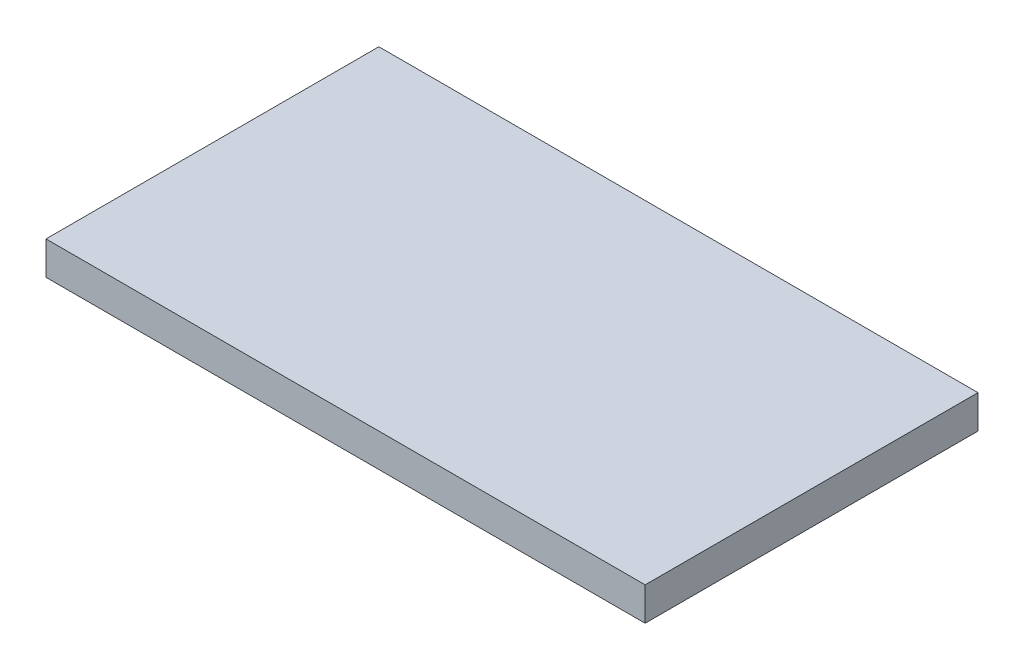
ISO-10303-21;
HEADER;
FILE_DESCRIPTION(('STEP AP214'),'2;1');
FILE_NAME('part.step','',(''),(''),'','','');
FILE_SCHEMA(('AUTOMOTIVE_DESIGN { 1 0 10303 214 1 1 1 1 }'));
ENDSEC;
DATA;
#1=APPLICATION_CONTEXT('core data for automotive mechanical design processes');
#2=APPLICATION_PROTOCOL_DEFINITION('international standard','automotive_design',2000,#1);
#3=PRODUCT_CONTEXT('',#1,'mechanical');
#4=PRODUCT('Part','Part','',(#3));
#5=PRODUCT_RELATED_PRODUCT_CATEGORY('part','',(#4));
#6=PRODUCT_DEFINITION_FORMATION('','',#4);
#7=PRODUCT_DEFINITION_CONTEXT('part definition',#1,'design');
#8=PRODUCT_DEFINITION('design','',#6,#7);
#9=PRODUCT_DEFINITION_SHAPE('','',#8);
#10=(LENGTH_UNIT() NAMED_UNIT(*) SI_UNIT(.MILLI.,.METRE.));
#11=(NAMED_UNIT(*) PLANE_ANGLE_UNIT() SI_UNIT($,.RADIAN.));
#12=(NAMED_UNIT(*) SI_UNIT($,.STERADIAN.) SOLID_ANGLE_UNIT());
#13=UNCERTAINTY_MEASURE_WITH_UNIT(LENGTH_MEASURE(1.E-05),#10,'distance_accuracy_value','');
#14=(GEOMETRIC_REPRESENTATION_CONTEXT(3) GLOBAL_UNCERTAINTY_ASSIGNED_CONTEXT((#13)) GLOBAL_UNIT_ASSIGNED_CONTEXT((#10,
#11,#12)) REPRESENTATION_CONTEXT('',''));
#15=CARTESIAN_POINT('',(0.,0.,0.));
#16=DIRECTION('',(0.,0.,1.));
#17=DIRECTION('',(1.,0.,0.));
#18=AXIS2_PLACEMENT_3D('',#15,#16,#17);
#19=CARTESIAN_POINT('',(-47.625,1.5875,7.9375));
#20=DIRECTION('',(0.,0.,-1.));
#21=DIRECTION('',(-1.,0.,0.));
#22=AXIS2_PLACEMENT_3D('',#19,#20,#21);
#23=PLANE('',#22);
#24=DIRECTION('',(0.,1.,0.));
#25=VECTOR('',#24,1.);
#26=CARTESIAN_POINT('',(-14.2875,-0.9525,7.9375));
#27=LINE('',#26,#25);
#28=CARTESIAN_POINT('',(-14.2875,0.,7.9375));
#29=VERTEX_POINT('',#28);
#30=CARTESIAN_POINT('',(-14.2875,1.5875,7.9375));
#31=VERTEX_POINT('',#30);
#32=EDGE_CURVE('E85',#29,#31,#27,.T.);
#33=ORIENTED_EDGE('',*,*,#32,.F.);
#34=DIRECTION('',(1.,0.,0.));
#35=VECTOR('',#34,1.);
#36=CARTESIAN_POINT('',(-47.625,0.,7.9375));
#37=LINE('',#36,#35);
#38=CARTESIAN_POINT('',(14.2875,0.,7.9375));
#39=VERTEX_POINT('',#38);
#40=EDGE_CURVE('E94',#29,#39,#37,.T.);
#41=ORIENTED_EDGE('',*,*,#40,.T.);
#42=DIRECTION('',(0.,1.,0.));
#43=VECTOR('',#42,1.);
#44=CARTESIAN_POINT('',(14.2875,-0.9525,7.9375));
#45=LINE('',#44,#43);
#46=CARTESIAN_POINT('',(14.2875,1.5875,7.9375));
#47=VERTEX_POINT('',#46);
#48=EDGE_CURVE('E53',#39,#47,#45,.T.);
#49=ORIENTED_EDGE('',*,*,#48,.T.);
#50=DIRECTION('',(1.,0.,0.));
#51=VECTOR('',#50,1.);
#52=CARTESIAN_POINT('',(-47.625,1.5875,7.9375));
#53=LINE('',#52,#51);
#54=EDGE_CURVE('E92',#31,#47,#53,.T.);
#55=ORIENTED_EDGE('',*,*,#54,.F.);
#56=EDGE_LOOP('',(#33,#41,#49,#55));
#57=FACE_BOUND('',#56,.T.);
#58=ADVANCED_FACE('F38',(#57),#23,.F.);
#59=CARTESIAN_POINT('',(-47.625,1.5875,-7.9375));
#60=DIRECTION('',(0.,0.,1.));
#61=DIRECTION('',(1.,0.,0.));
#62=AXIS2_PLACEMENT_3D('',#59,#60,#61);
#63=PLANE('',#62);
#64=DIRECTION('',(0.,1.,0.));
#65=VECTOR('',#64,1.);
#66=CARTESIAN_POINT('',(-14.2875,-0.9525,-7.9375));
#67=LINE('',#66,#65);
#68=CARTESIAN_POINT('',(-14.2875,0.,-7.9375));
#69=VERTEX_POINT('',#68);
#70=CARTESIAN_POINT('',(-14.2875,1.5875,-7.9375));
#71=VERTEX_POINT('',#70);
#72=EDGE_CURVE('E60',#69,#71,#67,.T.);
#73=ORIENTED_EDGE('',*,*,#72,.T.);
#74=DIRECTION('',(-1.,0.,0.));
#75=VECTOR('',#74,1.);
#76=CARTESIAN_POINT('',(-47.625,1.5875,-7.9375));
#77=LINE('',#76,#75);
#78=CARTESIAN_POINT('',(14.2875,1.5875,-7.9375));
#79=VERTEX_POINT('',#78);
#80=EDGE_CURVE('E100',#79,#71,#77,.T.);
#81=ORIENTED_EDGE('',*,*,#80,.F.);
#82=DIRECTION('',(0.,1.,0.));
#83=VECTOR('',#82,1.);
#84=CARTESIAN_POINT('',(14.2875,-0.9525,-7.9375));
#85=LINE('',#84,#83);
#86=CARTESIAN_POINT('',(14.2875,0.,-7.9375));
#87=VERTEX_POINT('',#86);
#88=EDGE_CURVE('E79',#87,#79,#85,.T.);
#89=ORIENTED_EDGE('',*,*,#88,.F.);
#90=DIRECTION('',(-1.,0.,0.));
#91=VECTOR('',#90,1.);
#92=CARTESIAN_POINT('',(-47.625,0.,-7.9375));
#93=LINE('',#92,#91);
#94=EDGE_CURVE('E101',#87,#69,#93,.T.);
#95=ORIENTED_EDGE('',*,*,#94,.T.);
#96=EDGE_LOOP('',(#73,#81,#89,#95));
#97=FACE_BOUND('',#96,.T.);
#98=ADVANCED_FACE('F115',(#97),#63,.F.);
#99=CARTESIAN_POINT('',(-47.625,1.5875,0.));
#100=DIRECTION('',(0.,1.,0.));
#101=DIRECTION('',(0.,0.,1.));
#102=AXIS2_PLACEMENT_3D('',#99,#100,#101);
#103=PLANE('',#102);
#104=ORIENTED_EDGE('',*,*,#80,.T.);
#105=DIRECTION('',(0.,0.,1.));
#106=VECTOR('',#105,1.);
#107=CARTESIAN_POINT('',(-14.2875,1.5875,-7.9375));
#108=LINE('',#107,#106);
#109=EDGE_CURVE('E86',#71,#31,#108,.T.);
#110=ORIENTED_EDGE('',*,*,#109,.T.);
#111=ORIENTED_EDGE('',*,*,#54,.T.);
#112=DIRECTION('',(0.,0.,-1.));
#113=VECTOR('',#112,1.);
#114=CARTESIAN_POINT('',(14.2875,1.5875,-7.9375));
#115=LINE('',#114,#113);
#116=EDGE_CURVE('E76',#47,#79,#115,.T.);
#117=ORIENTED_EDGE('',*,*,#116,.T.);
#118=EDGE_LOOP('',(#104,#110,#111,#117));
#119=FACE_BOUND('',#118,.T.);
#120=ADVANCED_FACE('F98',(#119),#103,.T.);
#121=CARTESIAN_POINT('',(-47.625,0.,0.));
#122=DIRECTION('',(0.,1.,0.));
#123=DIRECTION('',(0.,0.,1.));
#124=AXIS2_PLACEMENT_3D('',#121,#122,#123);
#125=PLANE('',#124);
#126=DIRECTION('',(0.,0.,1.));
#127=VECTOR('',#126,1.);
#128=CARTESIAN_POINT('',(-14.2875,0.,0.));
#129=LINE('',#128,#127);
#130=EDGE_CURVE('E11',#69,#29,#129,.T.);
#131=ORIENTED_EDGE('',*,*,#130,.F.);
#132=ORIENTED_EDGE('',*,*,#94,.F.);
#133=DIRECTION('',(0.,0.,-1.));
#134=VECTOR('',#133,1.);
#135=CARTESIAN_POINT('',(14.2875,0.,0.));
#136=LINE('',#135,#134);
#137=EDGE_CURVE('E46',#39,#87,#136,.T.);
#138=ORIENTED_EDGE('',*,*,#137,.F.);
#139=ORIENTED_EDGE('',*,*,#40,.F.);
#140=EDGE_LOOP('',(#131,#132,#138,#139));
#141=FACE_BOUND('',#140,.T.);
#142=ADVANCED_FACE('F118',(#141),#125,.F.);
#143=CARTESIAN_POINT('',(14.2875,-0.9525,-7.9375));
#144=DIRECTION('',(1.,0.,0.));
#145=DIRECTION('',(0.,0.,-1.));
#146=AXIS2_PLACEMENT_3D('',#143,#144,#145);
#147=PLANE('',#146);
#148=ORIENTED_EDGE('',*,*,#137,.T.);
#149=ORIENTED_EDGE('',*,*,#88,.T.);
#150=ORIENTED_EDGE('',*,*,#116,.F.);
#151=ORIENTED_EDGE('',*,*,#48,.F.);
#152=EDGE_LOOP('',(#148,#149,#150,#151));
#153=FACE_BOUND('',#152,.T.);
#154=ADVANCED_FACE('F77',(#153),#147,.T.);
#155=CARTESIAN_POINT('',(-14.2875,-0.9525,-7.9375));
#156=DIRECTION('',(-1.,0.,0.));
#157=DIRECTION('',(0.,0.,1.));
#158=AXIS2_PLACEMENT_3D('',#155,#156,#157);
#159=PLANE('',#158);
#160=ORIENTED_EDGE('',*,*,#130,.T.);
#161=ORIENTED_EDGE('',*,*,#32,.T.);
#162=ORIENTED_EDGE('',*,*,#109,.F.);
#163=ORIENTED_EDGE('',*,*,#72,.F.);
#164=EDGE_LOOP('',(#160,#161,#162,#163));
#165=FACE_BOUND('',#164,.T.);
#166=ADVANCED_FACE('F119',(#165),#159,.T.);
#167=CLOSED_SHELL('',(#58,#98,#120,#142,#154,#166));
#168=MANIFOLD_SOLID_BREP('B2',#167);
#169=ADVANCED_BREP_SHAPE_REPRESENTATION('',(#18,#168),#14);
#170=SHAPE_DEFINITION_REPRESENTATION(#9,#169);
ENDSEC;
END-ISO-10303-21;
